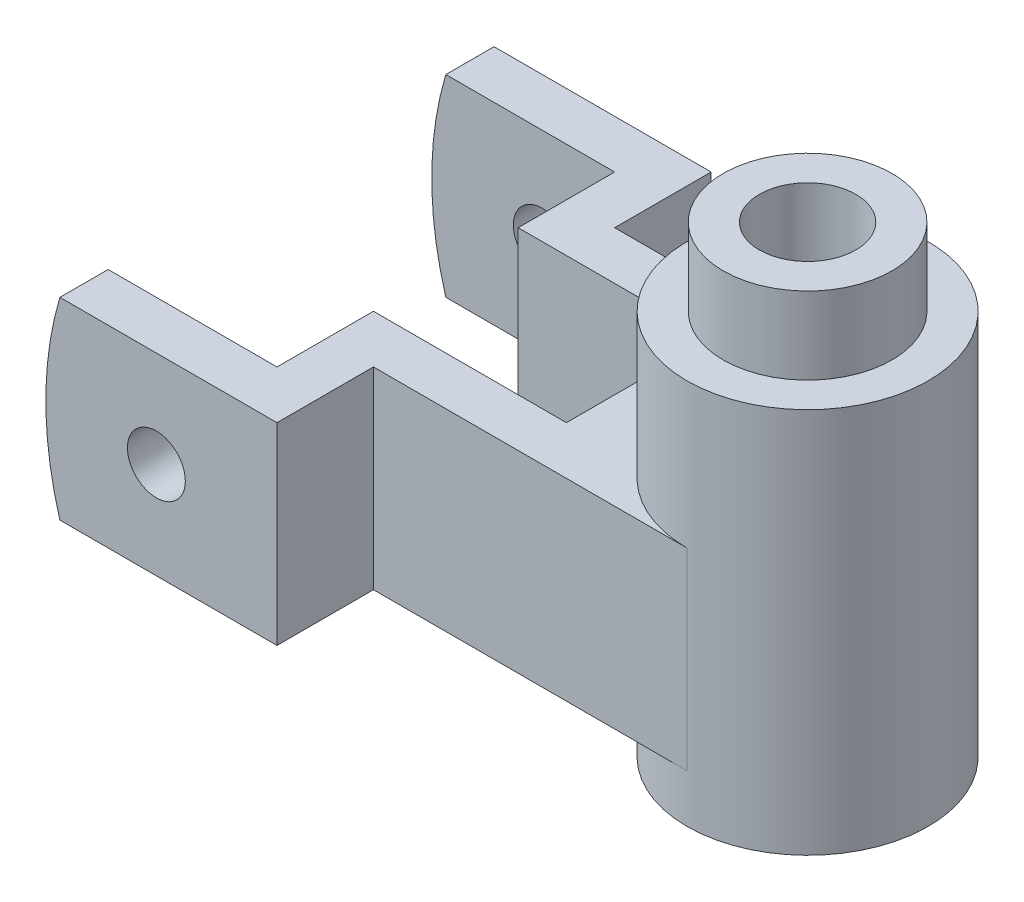
ISO-10303-21;
HEADER;
FILE_DESCRIPTION(('STEP AP214'),'2;1');
FILE_NAME('part.step','',(''),(''),'','','');
FILE_SCHEMA(('AUTOMOTIVE_DESIGN { 1 0 10303 214 1 1 1 1 }'));
ENDSEC;
DATA;
#1=APPLICATION_CONTEXT('core data for automotive mechanical design processes');
#2=APPLICATION_PROTOCOL_DEFINITION('international standard','automotive_design',2000,#1);
#3=PRODUCT_CONTEXT('',#1,'mechanical');
#4=PRODUCT('Part','Part','',(#3));
#5=PRODUCT_RELATED_PRODUCT_CATEGORY('part','',(#4));
#6=PRODUCT_DEFINITION_FORMATION('','',#4);
#7=PRODUCT_DEFINITION_CONTEXT('part definition',#1,'design');
#8=PRODUCT_DEFINITION('design','',#6,#7);
#9=PRODUCT_DEFINITION_SHAPE('','',#8);
#10=(LENGTH_UNIT() NAMED_UNIT(*) SI_UNIT(.MILLI.,.METRE.));
#11=(NAMED_UNIT(*) PLANE_ANGLE_UNIT() SI_UNIT($,.RADIAN.));
#12=(NAMED_UNIT(*) SI_UNIT($,.STERADIAN.) SOLID_ANGLE_UNIT());
#13=UNCERTAINTY_MEASURE_WITH_UNIT(LENGTH_MEASURE(1.E-05),#10,'distance_accuracy_value','');
#14=(GEOMETRIC_REPRESENTATION_CONTEXT(3) GLOBAL_UNCERTAINTY_ASSIGNED_CONTEXT((#13)) GLOBAL_UNIT_ASSIGNED_CONTEXT((#10,
#11,#12)) REPRESENTATION_CONTEXT('',''));
#15=CARTESIAN_POINT('',(0.,0.,0.));
#16=DIRECTION('',(0.,0.,1.));
#17=DIRECTION('',(1.,0.,0.));
#18=AXIS2_PLACEMENT_3D('',#15,#16,#17);
#19=CARTESIAN_POINT('',(-12.7569415466909,-30.,-35.));
#20=DIRECTION('',(0.,1.,0.));
#21=DIRECTION('',(0.,0.,1.));
#22=AXIS2_PLACEMENT_3D('',#19,#20,#21);
#23=CYLINDRICAL_SURFACE('',#22,25.);
#24=CARTESIAN_POINT('',(-12.7569415466909,50.,-35.));
#25=DIRECTION('',(0.,1.,0.));
#26=DIRECTION('',(0.,0.,1.));
#27=AXIS2_PLACEMENT_3D('',#24,#25,#26);
#28=CIRCLE('',#27,25.);
#29=CARTESIAN_POINT('',(-12.7569415466909,50.,-10.));
#30=VERTEX_POINT('',#29);
#31=EDGE_CURVE('E265',#30,#30,#28,.T.);
#32=ORIENTED_EDGE('',*,*,#31,.F.);
#33=EDGE_LOOP('',(#32));
#34=FACE_BOUND('',#33,.T.);
#35=CARTESIAN_POINT('',(-12.7569415466909,-30.,-35.));
#36=DIRECTION('',(0.,1.,0.));
#37=DIRECTION('',(0.,0.,1.));
#38=AXIS2_PLACEMENT_3D('',#35,#36,#37);
#39=CIRCLE('',#38,25.);
#40=CARTESIAN_POINT('',(-12.7569415466909,-30.,-10.));
#41=VERTEX_POINT('',#40);
#42=EDGE_CURVE('E270',#41,#41,#39,.T.);
#43=ORIENTED_EDGE('',*,*,#42,.T.);
#44=EDGE_LOOP('',(#43));
#45=FACE_BOUND('',#44,.T.);
#46=CARTESIAN_POINT('',(-12.7569415466909,-20.,-35.));
#47=DIRECTION('',(0.,1.,0.));
#48=DIRECTION('',(0.,0.,1.));
#49=AXIS2_PLACEMENT_3D('',#46,#47,#48);
#50=CIRCLE('',#49,25.);
#51=CARTESIAN_POINT('',(-12.7569415466909,-20.,-60.));
#52=VERTEX_POINT('',#51);
#53=CARTESIAN_POINT('',(-12.7569415466909,-20.,-10.));
#54=VERTEX_POINT('',#53);
#55=EDGE_CURVE('E58',#52,#54,#50,.T.);
#56=ORIENTED_EDGE('',*,*,#55,.F.);
#57=DIRECTION('',(0.,1.,0.));
#58=VECTOR('',#57,1.);
#59=CARTESIAN_POINT('',(-12.7569415466909,-20.,-60.));
#60=LINE('',#59,#58);
#61=CARTESIAN_POINT('',(-12.7569415466909,20.,-60.));
#62=VERTEX_POINT('',#61);
#63=EDGE_CURVE('E229',#52,#62,#60,.T.);
#64=ORIENTED_EDGE('',*,*,#63,.T.);
#65=CARTESIAN_POINT('',(-12.7569415466909,20.,-35.));
#66=DIRECTION('',(0.,1.,0.));
#67=DIRECTION('',(0.,0.,1.));
#68=AXIS2_PLACEMENT_3D('',#65,#66,#67);
#69=CIRCLE('',#68,25.);
#70=CARTESIAN_POINT('',(-12.7569415466909,20.,-10.));
#71=VERTEX_POINT('',#70);
#72=EDGE_CURVE('E274',#62,#71,#69,.T.);
#73=ORIENTED_EDGE('',*,*,#72,.T.);
#74=DIRECTION('',(0.,1.,0.));
#75=VECTOR('',#74,1.);
#76=CARTESIAN_POINT('',(-12.7569415466909,-20.,-10.));
#77=LINE('',#76,#75);
#78=EDGE_CURVE('E312',#54,#71,#77,.T.);
#79=ORIENTED_EDGE('',*,*,#78,.F.);
#80=EDGE_LOOP('',(#56,#64,#73,#79));
#81=FACE_BOUND('',#80,.T.);
#82=ADVANCED_FACE('F41',(#34,#45,#81),#23,.T.);
#83=CARTESIAN_POINT('',(0.,0.,0.));
#84=DIRECTION('',(0.,0.,1.));
#85=DIRECTION('',(1.,0.,0.));
#86=AXIS2_PLACEMENT_3D('',#83,#84,#85);
#87=PLANE('',#86);
#88=CARTESIAN_POINT('',(-102.756941546691,0.,0.));
#89=DIRECTION('',(0.,0.,1.));
#90=DIRECTION('',(1.,0.,0.));
#91=AXIS2_PLACEMENT_3D('',#88,#89,#90);
#92=CIRCLE('',#91,6.);
#93=CARTESIAN_POINT('',(-96.7569415466908,0.,0.));
#94=VERTEX_POINT('',#93);
#95=EDGE_CURVE('E315',#94,#94,#92,.T.);
#96=ORIENTED_EDGE('',*,*,#95,.T.);
#97=EDGE_LOOP('',(#96));
#98=FACE_BOUND('',#97,.T.);
#99=DIRECTION('',(0.,1.,0.));
#100=VECTOR('',#99,1.);
#101=CARTESIAN_POINT('',(-87.7569415466909,-20.,0.));
#102=LINE('',#101,#100);
#103=CARTESIAN_POINT('',(-87.7569415466909,-20.,0.));
#104=VERTEX_POINT('',#103);
#105=CARTESIAN_POINT('',(-87.7569415466909,20.,0.));
#106=VERTEX_POINT('',#105);
#107=EDGE_CURVE('E66',#104,#106,#102,.T.);
#108=ORIENTED_EDGE('',*,*,#107,.F.);
#109=DIRECTION('',(-1.,0.,0.));
#110=VECTOR('',#109,1.);
#111=CARTESIAN_POINT('',(0.,-20.,0.));
#112=LINE('',#111,#110);
#113=CARTESIAN_POINT('',(-122.756941546691,-20.,0.));
#114=VERTEX_POINT('',#113);
#115=EDGE_CURVE('E332',#104,#114,#112,.T.);
#116=ORIENTED_EDGE('',*,*,#115,.T.);
#117=CARTESIAN_POINT('',(-55.6749022216972,0.,0.));
#118=DIRECTION('',(0.,0.,1.));
#119=DIRECTION('',(1.,0.,0.));
#120=AXIS2_PLACEMENT_3D('',#117,#118,#119);
#121=CIRCLE('',#120,70.);
#122=CARTESIAN_POINT('',(-122.756941546691,20.,0.));
#123=VERTEX_POINT('',#122);
#124=EDGE_CURVE('E354',#123,#114,#121,.T.);
#125=ORIENTED_EDGE('',*,*,#124,.F.);
#126=DIRECTION('',(-1.,0.,0.));
#127=VECTOR('',#126,1.);
#128=CARTESIAN_POINT('',(0.,20.,0.));
#129=LINE('',#128,#127);
#130=EDGE_CURVE('E351',#106,#123,#129,.T.);
#131=ORIENTED_EDGE('',*,*,#130,.F.);
#132=EDGE_LOOP('',(#108,#116,#125,#131));
#133=FACE_BOUND('',#132,.T.);
#134=ADVANCED_FACE('F378',(#98,#133),#87,.F.);
#135=CARTESIAN_POINT('',(0.,20.,10.));
#136=DIRECTION('',(0.,-1.,0.));
#137=DIRECTION('',(0.,0.,-1.));
#138=AXIS2_PLACEMENT_3D('',#135,#136,#137);
#139=PLANE('',#138);
#140=DIRECTION('',(0.,0.,-1.));
#141=VECTOR('',#140,1.);
#142=CARTESIAN_POINT('',(-77.7569415466909,20.,10.));
#143=LINE('',#142,#141);
#144=CARTESIAN_POINT('',(-77.7569415466909,20.,10.));
#145=VERTEX_POINT('',#144);
#146=CARTESIAN_POINT('',(-77.7569415466909,20.,-10.));
#147=VERTEX_POINT('',#146);
#148=EDGE_CURVE('E347',#145,#147,#143,.T.);
#149=ORIENTED_EDGE('',*,*,#148,.T.);
#150=DIRECTION('',(1.,0.,0.));
#151=VECTOR('',#150,1.);
#152=CARTESIAN_POINT('',(0.,20.,-10.));
#153=LINE('',#152,#151);
#154=EDGE_CURVE('E278',#147,#71,#153,.T.);
#155=ORIENTED_EDGE('',*,*,#154,.T.);
#156=ORIENTED_EDGE('',*,*,#72,.F.);
#157=DIRECTION('',(1.,0.,0.));
#158=VECTOR('',#157,1.);
#159=CARTESIAN_POINT('',(0.,20.,-60.));
#160=LINE('',#159,#158);
#161=CARTESIAN_POINT('',(-77.7569415466909,20.,-60.));
#162=VERTEX_POINT('',#161);
#163=EDGE_CURVE('E165',#162,#62,#160,.T.);
#164=ORIENTED_EDGE('',*,*,#163,.F.);
#165=DIRECTION('',(0.,0.,1.));
#166=VECTOR('',#165,1.);
#167=CARTESIAN_POINT('',(-77.7569415466909,20.,-70.));
#168=LINE('',#167,#166);
#169=CARTESIAN_POINT('',(-77.7569415466909,20.,-80.));
#170=VERTEX_POINT('',#169);
#171=EDGE_CURVE('E157',#170,#162,#168,.T.);
#172=ORIENTED_EDGE('',*,*,#171,.F.);
#173=DIRECTION('',(-1.,0.,0.));
#174=VECTOR('',#173,1.);
#175=CARTESIAN_POINT('',(0.,20.,-80.));
#176=LINE('',#175,#174);
#177=CARTESIAN_POINT('',(-122.756941546691,20.,-80.));
#178=VERTEX_POINT('',#177);
#179=EDGE_CURVE('E162',#170,#178,#176,.T.);
#180=ORIENTED_EDGE('',*,*,#179,.T.);
#181=DIRECTION('',(0.,0.,1.));
#182=VECTOR('',#181,1.);
#183=CARTESIAN_POINT('',(-122.756941546691,20.,-80.));
#184=LINE('',#183,#182);
#185=CARTESIAN_POINT('',(-122.756941546691,20.,-70.));
#186=VERTEX_POINT('',#185);
#187=EDGE_CURVE('E196',#178,#186,#184,.T.);
#188=ORIENTED_EDGE('',*,*,#187,.T.);
#189=DIRECTION('',(-1.,0.,0.));
#190=VECTOR('',#189,1.);
#191=CARTESIAN_POINT('',(0.,20.,-70.));
#192=LINE('',#191,#190);
#193=CARTESIAN_POINT('',(-87.7569415466909,20.,-70.));
#194=VERTEX_POINT('',#193);
#195=EDGE_CURVE('E201',#194,#186,#192,.T.);
#196=ORIENTED_EDGE('',*,*,#195,.F.);
#197=DIRECTION('',(0.,0.,1.));
#198=VECTOR('',#197,1.);
#199=CARTESIAN_POINT('',(-87.7569415466909,20.,-70.));
#200=LINE('',#199,#198);
#201=CARTESIAN_POINT('',(-87.7569415466909,20.,-50.));
#202=VERTEX_POINT('',#201);
#203=EDGE_CURVE('E170',#194,#202,#200,.T.);
#204=ORIENTED_EDGE('',*,*,#203,.T.);
#205=DIRECTION('',(-1.,0.,0.));
#206=VECTOR('',#205,1.);
#207=CARTESIAN_POINT('',(0.,20.,-50.));
#208=LINE('',#207,#206);
#209=CARTESIAN_POINT('',(-47.7569415466909,20.,-50.));
#210=VERTEX_POINT('',#209);
#211=EDGE_CURVE('E219',#210,#202,#208,.T.);
#212=ORIENTED_EDGE('',*,*,#211,.F.);
#213=DIRECTION('',(0.,0.,1.));
#214=VECTOR('',#213,1.);
#215=CARTESIAN_POINT('',(-47.7569415466909,20.,0.));
#216=LINE('',#215,#214);
#217=CARTESIAN_POINT('',(-47.7569415466909,20.,-20.));
#218=VERTEX_POINT('',#217);
#219=EDGE_CURVE('E297',#210,#218,#216,.T.);
#220=ORIENTED_EDGE('',*,*,#219,.T.);
#221=DIRECTION('',(-1.,0.,0.));
#222=VECTOR('',#221,1.);
#223=CARTESIAN_POINT('',(0.,20.,-20.));
#224=LINE('',#223,#222);
#225=CARTESIAN_POINT('',(-87.7569415466909,20.,-20.));
#226=VERTEX_POINT('',#225);
#227=EDGE_CURVE('E301',#218,#226,#224,.T.);
#228=ORIENTED_EDGE('',*,*,#227,.T.);
#229=DIRECTION('',(0.,0.,-1.));
#230=VECTOR('',#229,1.);
#231=CARTESIAN_POINT('',(-87.7569415466909,20.,0.));
#232=LINE('',#231,#230);
#233=EDGE_CURVE('E305',#106,#226,#232,.T.);
#234=ORIENTED_EDGE('',*,*,#233,.F.);
#235=ORIENTED_EDGE('',*,*,#130,.T.);
#236=DIRECTION('',(0.,0.,-1.));
#237=VECTOR('',#236,1.);
#238=CARTESIAN_POINT('',(-122.756941546691,20.,10.));
#239=LINE('',#238,#237);
#240=CARTESIAN_POINT('',(-122.756941546691,20.,10.));
#241=VERTEX_POINT('',#240);
#242=EDGE_CURVE('E45',#241,#123,#239,.T.);
#243=ORIENTED_EDGE('',*,*,#242,.F.);
#244=DIRECTION('',(-1.,0.,0.));
#245=VECTOR('',#244,1.);
#246=CARTESIAN_POINT('',(0.,20.,10.));
#247=LINE('',#246,#245);
#248=EDGE_CURVE('E331',#145,#241,#247,.T.);
#249=ORIENTED_EDGE('',*,*,#248,.F.);
#250=EDGE_LOOP('',(#149,#155,#156,#164,#172,#180,#188,#196,#204,#212,#220,#228,#234,#235,#243,#249));
#251=FACE_BOUND('',#250,.T.);
#252=ADVANCED_FACE('F159',(#251),#139,.F.);
#253=CARTESIAN_POINT('',(-55.6749022216972,0.,10.));
#254=DIRECTION('',(0.,0.,-1.));
#255=DIRECTION('',(-1.,0.,0.));
#256=AXIS2_PLACEMENT_3D('',#253,#254,#255);
#257=CYLINDRICAL_SURFACE('',#256,70.);
#258=ORIENTED_EDGE('',*,*,#124,.T.);
#259=DIRECTION('',(0.,0.,-1.));
#260=VECTOR('',#259,1.);
#261=CARTESIAN_POINT('',(-122.756941546691,-20.,10.));
#262=LINE('',#261,#260);
#263=CARTESIAN_POINT('',(-122.756941546691,-20.,10.));
#264=VERTEX_POINT('',#263);
#265=EDGE_CURVE('E364',#264,#114,#262,.T.);
#266=ORIENTED_EDGE('',*,*,#265,.F.);
#267=CARTESIAN_POINT('',(-55.6749022216972,0.,10.));
#268=DIRECTION('',(0.,0.,1.));
#269=DIRECTION('',(1.,0.,0.));
#270=AXIS2_PLACEMENT_3D('',#267,#268,#269);
#271=CIRCLE('',#270,70.);
#272=EDGE_CURVE('E336',#241,#264,#271,.T.);
#273=ORIENTED_EDGE('',*,*,#272,.F.);
#274=ORIENTED_EDGE('',*,*,#242,.T.);
#275=EDGE_LOOP('',(#258,#266,#273,#274));
#276=FACE_BOUND('',#275,.T.);
#277=ADVANCED_FACE('F373',(#276),#257,.T.);
#278=CARTESIAN_POINT('',(0.,-20.,10.));
#279=DIRECTION('',(0.,-1.,0.));
#280=DIRECTION('',(1.,0.,0.));
#281=AXIS2_PLACEMENT_3D('',#278,#279,#280);
#282=PLANE('',#281);
#283=ORIENTED_EDGE('',*,*,#115,.F.);
#284=DIRECTION('',(0.,0.,-1.));
#285=VECTOR('',#284,1.);
#286=CARTESIAN_POINT('',(-87.7569415466909,-20.,0.));
#287=LINE('',#286,#285);
#288=CARTESIAN_POINT('',(-87.7569415466909,-20.,-20.));
#289=VERTEX_POINT('',#288);
#290=EDGE_CURVE('E286',#104,#289,#287,.T.);
#291=ORIENTED_EDGE('',*,*,#290,.T.);
#292=DIRECTION('',(-1.,0.,0.));
#293=VECTOR('',#292,1.);
#294=CARTESIAN_POINT('',(0.,-20.,-20.));
#295=LINE('',#294,#293);
#296=CARTESIAN_POINT('',(-47.7569415466909,-20.,-20.));
#297=VERTEX_POINT('',#296);
#298=EDGE_CURVE('E282',#297,#289,#295,.T.);
#299=ORIENTED_EDGE('',*,*,#298,.F.);
#300=DIRECTION('',(0.,0.,1.));
#301=VECTOR('',#300,1.);
#302=CARTESIAN_POINT('',(-47.7569415466909,-20.,0.));
#303=LINE('',#302,#301);
#304=CARTESIAN_POINT('',(-47.7569415466909,-20.,-50.));
#305=VERTEX_POINT('',#304);
#306=EDGE_CURVE('E277',#305,#297,#303,.T.);
#307=ORIENTED_EDGE('',*,*,#306,.F.);
#308=DIRECTION('',(-1.,0.,0.));
#309=VECTOR('',#308,1.);
#310=CARTESIAN_POINT('',(0.,-20.,-50.));
#311=LINE('',#310,#309);
#312=CARTESIAN_POINT('',(-87.7569415466909,-20.,-50.));
#313=VERTEX_POINT('',#312);
#314=EDGE_CURVE('E226',#305,#313,#311,.T.);
#315=ORIENTED_EDGE('',*,*,#314,.T.);
#316=DIRECTION('',(0.,0.,1.));
#317=VECTOR('',#316,1.);
#318=CARTESIAN_POINT('',(-87.7569415466909,-20.,-70.));
#319=LINE('',#318,#317);
#320=CARTESIAN_POINT('',(-87.7569415466909,-20.,-70.));
#321=VERTEX_POINT('',#320);
#322=EDGE_CURVE('E222',#321,#313,#319,.T.);
#323=ORIENTED_EDGE('',*,*,#322,.F.);
#324=DIRECTION('',(-1.,0.,0.));
#325=VECTOR('',#324,1.);
#326=CARTESIAN_POINT('',(0.,-20.,-70.));
#327=LINE('',#326,#325);
#328=CARTESIAN_POINT('',(-122.756941546691,-20.,-70.));
#329=VERTEX_POINT('',#328);
#330=EDGE_CURVE('E204',#321,#329,#327,.T.);
#331=ORIENTED_EDGE('',*,*,#330,.T.);
#332=DIRECTION('',(0.,0.,1.));
#333=VECTOR('',#332,1.);
#334=CARTESIAN_POINT('',(-122.756941546691,-20.,-80.));
#335=LINE('',#334,#333);
#336=CARTESIAN_POINT('',(-122.756941546691,-20.,-80.));
#337=VERTEX_POINT('',#336);
#338=EDGE_CURVE('E212',#337,#329,#335,.T.);
#339=ORIENTED_EDGE('',*,*,#338,.F.);
#340=DIRECTION('',(-1.,0.,0.));
#341=VECTOR('',#340,1.);
#342=CARTESIAN_POINT('',(0.,-20.,-80.));
#343=LINE('',#342,#341);
#344=CARTESIAN_POINT('',(-77.7569415466909,-20.,-80.));
#345=VERTEX_POINT('',#344);
#346=EDGE_CURVE('E179',#345,#337,#343,.T.);
#347=ORIENTED_EDGE('',*,*,#346,.F.);
#348=DIRECTION('',(0.,0.,1.));
#349=VECTOR('',#348,1.);
#350=CARTESIAN_POINT('',(-77.7569415466909,-20.,-70.));
#351=LINE('',#350,#349);
#352=CARTESIAN_POINT('',(-77.7569415466909,-20.,-60.));
#353=VERTEX_POINT('',#352);
#354=EDGE_CURVE('E175',#345,#353,#351,.T.);
#355=ORIENTED_EDGE('',*,*,#354,.T.);
#356=DIRECTION('',(1.,0.,0.));
#357=VECTOR('',#356,1.);
#358=CARTESIAN_POINT('',(0.,-20.,-60.));
#359=LINE('',#358,#357);
#360=EDGE_CURVE('E216',#353,#52,#359,.T.);
#361=ORIENTED_EDGE('',*,*,#360,.T.);
#362=ORIENTED_EDGE('',*,*,#55,.T.);
#363=DIRECTION('',(1.,0.,0.));
#364=VECTOR('',#363,1.);
#365=CARTESIAN_POINT('',(0.,-20.,-10.));
#366=LINE('',#365,#364);
#367=CARTESIAN_POINT('',(-77.7569415466909,-20.,-10.));
#368=VERTEX_POINT('',#367);
#369=EDGE_CURVE('E289',#368,#54,#366,.T.);
#370=ORIENTED_EDGE('',*,*,#369,.F.);
#371=DIRECTION('',(0.,0.,-1.));
#372=VECTOR('',#371,1.);
#373=CARTESIAN_POINT('',(-77.7569415466909,-20.,10.));
#374=LINE('',#373,#372);
#375=CARTESIAN_POINT('',(-77.7569415466909,-20.,10.));
#376=VERTEX_POINT('',#375);
#377=EDGE_CURVE('E362',#376,#368,#374,.T.);
#378=ORIENTED_EDGE('',*,*,#377,.F.);
#379=DIRECTION('',(-1.,0.,0.));
#380=VECTOR('',#379,1.);
#381=CARTESIAN_POINT('',(0.,-20.,10.));
#382=LINE('',#381,#380);
#383=EDGE_CURVE('E339',#376,#264,#382,.T.);
#384=ORIENTED_EDGE('',*,*,#383,.T.);
#385=ORIENTED_EDGE('',*,*,#265,.T.);
#386=EDGE_LOOP('',(#283,#291,#299,#307,#315,#323,#331,#339,#347,#355,#361,#362,#370,#378,#384,#385));
#387=FACE_BOUND('',#386,.T.);
#388=ADVANCED_FACE('F380',(#387),#282,.T.);
#389=CARTESIAN_POINT('',(-102.756941546691,0.,10.));
#390=DIRECTION('',(0.,0.,-1.));
#391=DIRECTION('',(-1.,0.,0.));
#392=AXIS2_PLACEMENT_3D('',#389,#390,#391);
#393=CYLINDRICAL_SURFACE('',#392,6.);
#394=CARTESIAN_POINT('',(-102.756941546691,0.,10.));
#395=DIRECTION('',(0.,0.,1.));
#396=DIRECTION('',(1.,0.,0.));
#397=AXIS2_PLACEMENT_3D('',#394,#395,#396);
#398=CIRCLE('',#397,6.);
#399=CARTESIAN_POINT('',(-96.7569415466908,0.,10.));
#400=VERTEX_POINT('',#399);
#401=EDGE_CURVE('E327',#400,#400,#398,.T.);
#402=ORIENTED_EDGE('',*,*,#401,.T.);
#403=EDGE_LOOP('',(#402));
#404=FACE_BOUND('',#403,.T.);
#405=ORIENTED_EDGE('',*,*,#95,.F.);
#406=EDGE_LOOP('',(#405));
#407=FACE_BOUND('',#406,.T.);
#408=ADVANCED_FACE('F43',(#404,#407),#393,.F.);
#409=CARTESIAN_POINT('',(-77.7569415466909,0.,10.));
#410=DIRECTION('',(1.,0.,0.));
#411=DIRECTION('',(0.,0.,-1.));
#412=AXIS2_PLACEMENT_3D('',#409,#410,#411);
#413=PLANE('',#412);
#414=ORIENTED_EDGE('',*,*,#377,.T.);
#415=DIRECTION('',(0.,1.,0.));
#416=VECTOR('',#415,1.);
#417=CARTESIAN_POINT('',(-77.7569415466909,-20.,-10.));
#418=LINE('',#417,#416);
#419=EDGE_CURVE('E316',#368,#147,#418,.T.);
#420=ORIENTED_EDGE('',*,*,#419,.T.);
#421=ORIENTED_EDGE('',*,*,#148,.F.);
#422=DIRECTION('',(0.,-1.,0.));
#423=VECTOR('',#422,1.);
#424=CARTESIAN_POINT('',(-77.7569415466909,0.,10.));
#425=LINE('',#424,#423);
#426=EDGE_CURVE('E343',#145,#376,#425,.T.);
#427=ORIENTED_EDGE('',*,*,#426,.T.);
#428=EDGE_LOOP('',(#414,#420,#421,#427));
#429=FACE_BOUND('',#428,.T.);
#430=ADVANCED_FACE('F419',(#429),#413,.T.);
#431=CARTESIAN_POINT('',(0.,0.,10.));
#432=DIRECTION('',(0.,0.,1.));
#433=DIRECTION('',(1.,0.,0.));
#434=AXIS2_PLACEMENT_3D('',#431,#432,#433);
#435=PLANE('',#434);
#436=ORIENTED_EDGE('',*,*,#401,.F.);
#437=EDGE_LOOP('',(#436));
#438=FACE_BOUND('',#437,.T.);
#439=ORIENTED_EDGE('',*,*,#248,.T.);
#440=ORIENTED_EDGE('',*,*,#272,.T.);
#441=ORIENTED_EDGE('',*,*,#383,.F.);
#442=ORIENTED_EDGE('',*,*,#426,.F.);
#443=EDGE_LOOP('',(#439,#440,#441,#442));
#444=FACE_BOUND('',#443,.T.);
#445=ADVANCED_FACE('F418',(#438,#444),#435,.T.);
#446=CARTESIAN_POINT('',(0.,-20.,-10.));
#447=DIRECTION('',(0.,0.,1.));
#448=DIRECTION('',(1.,0.,0.));
#449=AXIS2_PLACEMENT_3D('',#446,#447,#448);
#450=PLANE('',#449);
#451=ORIENTED_EDGE('',*,*,#154,.F.);
#452=ORIENTED_EDGE('',*,*,#419,.F.);
#453=ORIENTED_EDGE('',*,*,#369,.T.);
#454=ORIENTED_EDGE('',*,*,#78,.T.);
#455=EDGE_LOOP('',(#451,#452,#453,#454));
#456=FACE_BOUND('',#455,.T.);
#457=ADVANCED_FACE('F413',(#456),#450,.T.);
#458=CARTESIAN_POINT('',(-87.7569415466909,-20.,0.));
#459=DIRECTION('',(1.,0.,0.));
#460=DIRECTION('',(0.,0.,-1.));
#461=AXIS2_PLACEMENT_3D('',#458,#459,#460);
#462=PLANE('',#461);
#463=ORIENTED_EDGE('',*,*,#233,.T.);
#464=DIRECTION('',(0.,1.,0.));
#465=VECTOR('',#464,1.);
#466=CARTESIAN_POINT('',(-87.7569415466909,-20.,-20.));
#467=LINE('',#466,#465);
#468=EDGE_CURVE('E322',#289,#226,#467,.T.);
#469=ORIENTED_EDGE('',*,*,#468,.F.);
#470=ORIENTED_EDGE('',*,*,#290,.F.);
#471=ORIENTED_EDGE('',*,*,#107,.T.);
#472=EDGE_LOOP('',(#463,#469,#470,#471));
#473=FACE_BOUND('',#472,.T.);
#474=ADVANCED_FACE('F384',(#473),#462,.F.);
#475=CARTESIAN_POINT('',(0.,-20.,-20.));
#476=DIRECTION('',(0.,0.,-1.));
#477=DIRECTION('',(-1.,0.,0.));
#478=AXIS2_PLACEMENT_3D('',#475,#476,#477);
#479=PLANE('',#478);
#480=ORIENTED_EDGE('',*,*,#227,.F.);
#481=DIRECTION('',(0.,1.,0.));
#482=VECTOR('',#481,1.);
#483=CARTESIAN_POINT('',(-47.7569415466909,-20.,-20.));
#484=LINE('',#483,#482);
#485=EDGE_CURVE('E293',#297,#218,#484,.T.);
#486=ORIENTED_EDGE('',*,*,#485,.F.);
#487=ORIENTED_EDGE('',*,*,#298,.T.);
#488=ORIENTED_EDGE('',*,*,#468,.T.);
#489=EDGE_LOOP('',(#480,#486,#487,#488));
#490=FACE_BOUND('',#489,.T.);
#491=ADVANCED_FACE('F387',(#490),#479,.T.);
#492=CARTESIAN_POINT('',(-47.7569415466909,-20.,0.));
#493=DIRECTION('',(-1.,0.,0.));
#494=DIRECTION('',(0.,0.,1.));
#495=AXIS2_PLACEMENT_3D('',#492,#493,#494);
#496=PLANE('',#495);
#497=ORIENTED_EDGE('',*,*,#219,.F.);
#498=DIRECTION('',(0.,1.,0.));
#499=VECTOR('',#498,1.);
#500=CARTESIAN_POINT('',(-47.7569415466909,-20.,-50.));
#501=LINE('',#500,#499);
#502=EDGE_CURVE('E238',#305,#210,#501,.T.);
#503=ORIENTED_EDGE('',*,*,#502,.F.);
#504=ORIENTED_EDGE('',*,*,#306,.T.);
#505=ORIENTED_EDGE('',*,*,#485,.T.);
#506=EDGE_LOOP('',(#497,#503,#504,#505));
#507=FACE_BOUND('',#506,.T.);
#508=ADVANCED_FACE('F390',(#507),#496,.T.);
#509=CARTESIAN_POINT('',(0.,-30.,0.));
#510=DIRECTION('',(0.,1.,0.));
#511=DIRECTION('',(0.,0.,1.));
#512=AXIS2_PLACEMENT_3D('',#509,#510,#511);
#513=PLANE('',#512);
#514=CARTESIAN_POINT('',(-12.7569415466909,-30.,-35.));
#515=DIRECTION('',(0.,1.,0.));
#516=DIRECTION('',(0.,0.,1.));
#517=AXIS2_PLACEMENT_3D('',#514,#515,#516);
#518=CIRCLE('',#517,10.);
#519=CARTESIAN_POINT('',(-12.7569415466909,-30.,-25.));
#520=VERTEX_POINT('',#519);
#521=EDGE_CURVE('E258',#520,#520,#518,.T.);
#522=ORIENTED_EDGE('',*,*,#521,.T.);
#523=EDGE_LOOP('',(#522));
#524=FACE_BOUND('',#523,.T.);
#525=ORIENTED_EDGE('',*,*,#42,.F.);
#526=EDGE_LOOP('',(#525));
#527=FACE_BOUND('',#526,.T.);
#528=ADVANCED_FACE('F442',(#524,#527),#513,.F.);
#529=CARTESIAN_POINT('',(0.,50.,0.));
#530=DIRECTION('',(0.,1.,0.));
#531=DIRECTION('',(0.,0.,1.));
#532=AXIS2_PLACEMENT_3D('',#529,#530,#531);
#533=PLANE('',#532);
#534=CARTESIAN_POINT('',(-12.7569415466909,50.,-35.));
#535=DIRECTION('',(0.,1.,0.));
#536=DIRECTION('',(0.,0.,1.));
#537=AXIS2_PLACEMENT_3D('',#534,#535,#536);
#538=CIRCLE('',#537,17.5);
#539=CARTESIAN_POINT('',(-12.7569415466909,50.,-17.5));
#540=VERTEX_POINT('',#539);
#541=EDGE_CURVE('E11',#540,#540,#538,.T.);
#542=ORIENTED_EDGE('',*,*,#541,.F.);
#543=EDGE_LOOP('',(#542));
#544=FACE_BOUND('',#543,.T.);
#545=ORIENTED_EDGE('',*,*,#31,.T.);
#546=EDGE_LOOP('',(#545));
#547=FACE_BOUND('',#546,.T.);
#548=ADVANCED_FACE('F454',(#544,#547),#533,.T.);
#549=CARTESIAN_POINT('',(-12.7569415466909,66.,-35.));
#550=DIRECTION('',(0.,-1.,0.));
#551=DIRECTION('',(0.,0.,-1.));
#552=AXIS2_PLACEMENT_3D('',#549,#550,#551);
#553=CYLINDRICAL_SURFACE('',#552,17.5);
#554=CARTESIAN_POINT('',(-12.7569415466909,66.,-35.));
#555=DIRECTION('',(0.,1.,0.));
#556=DIRECTION('',(0.,0.,1.));
#557=AXIS2_PLACEMENT_3D('',#554,#555,#556);
#558=CIRCLE('',#557,17.5);
#559=CARTESIAN_POINT('',(-12.7569415466909,66.,-17.5));
#560=VERTEX_POINT('',#559);
#561=EDGE_CURVE('E262',#560,#560,#558,.T.);
#562=ORIENTED_EDGE('',*,*,#561,.F.);
#563=EDGE_LOOP('',(#562));
#564=FACE_BOUND('',#563,.T.);
#565=ORIENTED_EDGE('',*,*,#541,.T.);
#566=EDGE_LOOP('',(#565));
#567=FACE_BOUND('',#566,.T.);
#568=ADVANCED_FACE('F459',(#564,#567),#553,.T.);
#569=CARTESIAN_POINT('',(-12.7569415466909,66.,-35.));
#570=DIRECTION('',(0.,1.,0.));
#571=DIRECTION('',(0.,0.,1.));
#572=AXIS2_PLACEMENT_3D('',#569,#570,#571);
#573=PLANE('',#572);
#574=CARTESIAN_POINT('',(-12.7569415466909,66.,-35.));
#575=DIRECTION('',(0.,1.,0.));
#576=DIRECTION('',(0.,0.,1.));
#577=AXIS2_PLACEMENT_3D('',#574,#575,#576);
#578=CIRCLE('',#577,10.);
#579=CARTESIAN_POINT('',(-12.7569415466909,66.,-25.));
#580=VERTEX_POINT('',#579);
#581=EDGE_CURVE('E242',#580,#580,#578,.T.);
#582=ORIENTED_EDGE('',*,*,#581,.F.);
#583=EDGE_LOOP('',(#582));
#584=FACE_BOUND('',#583,.T.);
#585=ORIENTED_EDGE('',*,*,#561,.T.);
#586=EDGE_LOOP('',(#585));
#587=FACE_BOUND('',#586,.T.);
#588=ADVANCED_FACE('F467',(#584,#587),#573,.T.);
#589=CARTESIAN_POINT('',(-12.7569415466909,-77.,-35.));
#590=DIRECTION('',(0.,1.,0.));
#591=DIRECTION('',(0.,0.,1.));
#592=AXIS2_PLACEMENT_3D('',#589,#590,#591);
#593=CYLINDRICAL_SURFACE('',#592,10.);
#594=ORIENTED_EDGE('',*,*,#581,.T.);
#595=EDGE_LOOP('',(#594));
#596=FACE_BOUND('',#595,.T.);
#597=ORIENTED_EDGE('',*,*,#521,.F.);
#598=EDGE_LOOP('',(#597));
#599=FACE_BOUND('',#598,.T.);
#600=ADVANCED_FACE('F465',(#596,#599),#593,.F.);
#601=CARTESIAN_POINT('',(0.,-20.,-50.));
#602=DIRECTION('',(0.,0.,-1.));
#603=DIRECTION('',(-1.,0.,0.));
#604=AXIS2_PLACEMENT_3D('',#601,#602,#603);
#605=PLANE('',#604);
#606=ORIENTED_EDGE('',*,*,#211,.T.);
#607=DIRECTION('',(0.,1.,0.));
#608=VECTOR('',#607,1.);
#609=CARTESIAN_POINT('',(-87.7569415466909,-20.,-50.));
#610=LINE('',#609,#608);
#611=EDGE_CURVE('E243',#313,#202,#610,.T.);
#612=ORIENTED_EDGE('',*,*,#611,.F.);
#613=ORIENTED_EDGE('',*,*,#314,.F.);
#614=ORIENTED_EDGE('',*,*,#502,.T.);
#615=EDGE_LOOP('',(#606,#612,#613,#614));
#616=FACE_BOUND('',#615,.T.);
#617=ADVANCED_FACE('F395',(#616),#605,.F.);
#618=CARTESIAN_POINT('',(-87.7569415466909,-20.,-70.));
#619=DIRECTION('',(-1.,0.,0.));
#620=DIRECTION('',(0.,0.,1.));
#621=AXIS2_PLACEMENT_3D('',#618,#619,#620);
#622=PLANE('',#621);
#623=ORIENTED_EDGE('',*,*,#203,.F.);
#624=DIRECTION('',(0.,1.,0.));
#625=VECTOR('',#624,1.);
#626=CARTESIAN_POINT('',(-87.7569415466909,-20.,-70.));
#627=LINE('',#626,#625);
#628=EDGE_CURVE('E246',#321,#194,#627,.T.);
#629=ORIENTED_EDGE('',*,*,#628,.F.);
#630=ORIENTED_EDGE('',*,*,#322,.T.);
#631=ORIENTED_EDGE('',*,*,#611,.T.);
#632=EDGE_LOOP('',(#623,#629,#630,#631));
#633=FACE_BOUND('',#632,.T.);
#634=ADVANCED_FACE('F474',(#633),#622,.T.);
#635=CARTESIAN_POINT('',(-77.7569415466909,-20.,-70.));
#636=DIRECTION('',(-1.,0.,0.));
#637=DIRECTION('',(0.,0.,1.));
#638=AXIS2_PLACEMENT_3D('',#635,#636,#637);
#639=PLANE('',#638);
#640=ORIENTED_EDGE('',*,*,#171,.T.);
#641=DIRECTION('',(0.,1.,0.));
#642=VECTOR('',#641,1.);
#643=CARTESIAN_POINT('',(-77.7569415466909,-20.,-60.));
#644=LINE('',#643,#642);
#645=EDGE_CURVE('E250',#353,#162,#644,.T.);
#646=ORIENTED_EDGE('',*,*,#645,.F.);
#647=ORIENTED_EDGE('',*,*,#354,.F.);
#648=DIRECTION('',(0.,-1.,0.));
#649=VECTOR('',#648,1.);
#650=CARTESIAN_POINT('',(-77.7569415466909,0.,-80.));
#651=LINE('',#650,#649);
#652=EDGE_CURVE('E173',#170,#345,#651,.T.);
#653=ORIENTED_EDGE('',*,*,#652,.F.);
#654=EDGE_LOOP('',(#640,#646,#647,#653));
#655=FACE_BOUND('',#654,.T.);
#656=ADVANCED_FACE('F174',(#655),#639,.F.);
#657=CARTESIAN_POINT('',(0.,-20.,-60.));
#658=DIRECTION('',(0.,0.,1.));
#659=DIRECTION('',(1.,0.,0.));
#660=AXIS2_PLACEMENT_3D('',#657,#658,#659);
#661=PLANE('',#660);
#662=ORIENTED_EDGE('',*,*,#163,.T.);
#663=ORIENTED_EDGE('',*,*,#63,.F.);
#664=ORIENTED_EDGE('',*,*,#360,.F.);
#665=ORIENTED_EDGE('',*,*,#645,.T.);
#666=EDGE_LOOP('',(#662,#663,#664,#665));
#667=FACE_BOUND('',#666,.T.);
#668=ADVANCED_FACE('F409',(#667),#661,.F.);
#669=CARTESIAN_POINT('',(0.,0.,-70.));
#670=DIRECTION('',(0.,0.,-1.));
#671=DIRECTION('',(1.,0.,0.));
#672=AXIS2_PLACEMENT_3D('',#669,#670,#671);
#673=PLANE('',#672);
#674=CARTESIAN_POINT('',(-102.756941546691,0.,-70.));
#675=DIRECTION('',(0.,0.,1.));
#676=DIRECTION('',(1.,0.,0.));
#677=AXIS2_PLACEMENT_3D('',#674,#675,#676);
#678=CIRCLE('',#677,6.);
#679=CARTESIAN_POINT('',(-96.7569415466908,0.,-70.));
#680=VERTEX_POINT('',#679);
#681=EDGE_CURVE('E197',#680,#680,#678,.T.);
#682=ORIENTED_EDGE('',*,*,#681,.F.);
#683=EDGE_LOOP('',(#682));
#684=FACE_BOUND('',#683,.T.);
#685=ORIENTED_EDGE('',*,*,#330,.F.);
#686=ORIENTED_EDGE('',*,*,#628,.T.);
#687=ORIENTED_EDGE('',*,*,#195,.T.);
#688=CARTESIAN_POINT('',(-55.6749022216972,0.,-70.));
#689=DIRECTION('',(0.,0.,1.));
#690=DIRECTION('',(1.,0.,0.));
#691=AXIS2_PLACEMENT_3D('',#688,#689,#690);
#692=CIRCLE('',#691,70.);
#693=EDGE_CURVE('E189',#186,#329,#692,.T.);
#694=ORIENTED_EDGE('',*,*,#693,.T.);
#695=EDGE_LOOP('',(#685,#686,#687,#694));
#696=FACE_BOUND('',#695,.T.);
#697=ADVANCED_FACE('F401',(#684,#696),#673,.F.);
#698=CARTESIAN_POINT('',(-102.756941546691,0.,-80.));
#699=DIRECTION('',(0.,0.,1.));
#700=DIRECTION('',(1.,0.,0.));
#701=AXIS2_PLACEMENT_3D('',#698,#699,#700);
#702=CYLINDRICAL_SURFACE('',#701,6.);
#703=CARTESIAN_POINT('',(-102.756941546691,0.,-80.));
#704=DIRECTION('',(0.,0.,1.));
#705=DIRECTION('',(1.,0.,0.));
#706=AXIS2_PLACEMENT_3D('',#703,#704,#705);
#707=CIRCLE('',#706,6.);
#708=CARTESIAN_POINT('',(-96.7569415466908,0.,-80.));
#709=VERTEX_POINT('',#708);
#710=EDGE_CURVE('E185',#709,#709,#707,.T.);
#711=ORIENTED_EDGE('',*,*,#710,.F.);
#712=EDGE_LOOP('',(#711));
#713=FACE_BOUND('',#712,.T.);
#714=ORIENTED_EDGE('',*,*,#681,.T.);
#715=EDGE_LOOP('',(#714));
#716=FACE_BOUND('',#715,.T.);
#717=ADVANCED_FACE('F568',(#713,#716),#702,.F.);
#718=CARTESIAN_POINT('',(-55.6749022216972,0.,-80.));
#719=DIRECTION('',(0.,0.,1.));
#720=DIRECTION('',(1.,0.,0.));
#721=AXIS2_PLACEMENT_3D('',#718,#719,#720);
#722=CYLINDRICAL_SURFACE('',#721,70.);
#723=ORIENTED_EDGE('',*,*,#693,.F.);
#724=ORIENTED_EDGE('',*,*,#187,.F.);
#725=CARTESIAN_POINT('',(-55.6749022216972,0.,-80.));
#726=DIRECTION('',(0.,0.,1.));
#727=DIRECTION('',(1.,0.,0.));
#728=AXIS2_PLACEMENT_3D('',#725,#726,#727);
#729=CIRCLE('',#728,70.);
#730=EDGE_CURVE('E183',#178,#337,#729,.T.);
#731=ORIENTED_EDGE('',*,*,#730,.T.);
#732=ORIENTED_EDGE('',*,*,#338,.T.);
#733=EDGE_LOOP('',(#723,#724,#731,#732));
#734=FACE_BOUND('',#733,.T.);
#735=ADVANCED_FACE('F405',(#734),#722,.T.);
#736=CARTESIAN_POINT('',(0.,0.,-80.));
#737=DIRECTION('',(0.,0.,-1.));
#738=DIRECTION('',(1.,0.,0.));
#739=AXIS2_PLACEMENT_3D('',#736,#737,#738);
#740=PLANE('',#739);
#741=ORIENTED_EDGE('',*,*,#710,.T.);
#742=EDGE_LOOP('',(#741));
#743=FACE_BOUND('',#742,.T.);
#744=ORIENTED_EDGE('',*,*,#179,.F.);
#745=ORIENTED_EDGE('',*,*,#652,.T.);
#746=ORIENTED_EDGE('',*,*,#346,.T.);
#747=ORIENTED_EDGE('',*,*,#730,.F.);
#748=EDGE_LOOP('',(#744,#745,#746,#747));
#749=FACE_BOUND('',#748,.T.);
#750=ADVANCED_FACE('F181',(#743,#749),#740,.T.);
#751=CLOSED_SHELL('',(#82,#134,#252,#277,#388,#408,#430,#445,#457,#474,#491,#508,#528,#548,#568,
#588,#600,#617,#634,#656,#668,#697,#717,#735,#750));
#752=MANIFOLD_SOLID_BREP('B2',#751);
#753=ADVANCED_BREP_SHAPE_REPRESENTATION('',(#18,#752),#14);
#754=SHAPE_DEFINITION_REPRESENTATION(#9,#753);
ENDSEC;
END-ISO-10303-21;
